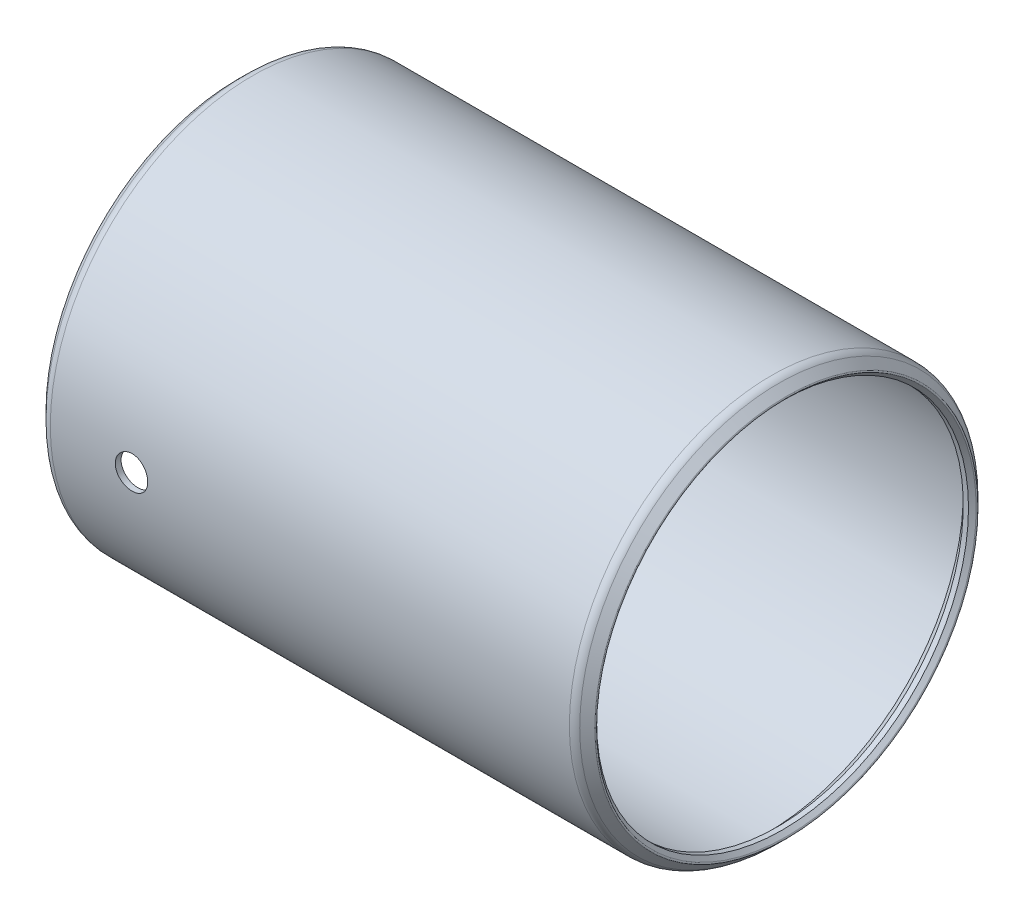
ISO-10303-21;
HEADER;
FILE_DESCRIPTION(('STEP AP214'),'2;1');
FILE_NAME('part.step','',(''),(''),'','','');
FILE_SCHEMA(('AUTOMOTIVE_DESIGN { 1 0 10303 214 1 1 1 1 }'));
ENDSEC;
DATA;
#1=APPLICATION_CONTEXT('core data for automotive mechanical design processes');
#2=APPLICATION_PROTOCOL_DEFINITION('international standard','automotive_design',2000,#1);
#3=PRODUCT_CONTEXT('',#1,'mechanical');
#4=PRODUCT('Part','Part','',(#3));
#5=PRODUCT_RELATED_PRODUCT_CATEGORY('part','',(#4));
#6=PRODUCT_DEFINITION_FORMATION('','',#4);
#7=PRODUCT_DEFINITION_CONTEXT('part definition',#1,'design');
#8=PRODUCT_DEFINITION('design','',#6,#7);
#9=PRODUCT_DEFINITION_SHAPE('','',#8);
#10=(LENGTH_UNIT() NAMED_UNIT(*) SI_UNIT(.MILLI.,.METRE.));
#11=(NAMED_UNIT(*) PLANE_ANGLE_UNIT() SI_UNIT($,.RADIAN.));
#12=(NAMED_UNIT(*) SI_UNIT($,.STERADIAN.) SOLID_ANGLE_UNIT());
#13=UNCERTAINTY_MEASURE_WITH_UNIT(LENGTH_MEASURE(1.E-05),#10,'distance_accuracy_value','');
#14=(GEOMETRIC_REPRESENTATION_CONTEXT(3) GLOBAL_UNCERTAINTY_ASSIGNED_CONTEXT((#13)) GLOBAL_UNIT_ASSIGNED_CONTEXT((#10,
#11,#12)) REPRESENTATION_CONTEXT('',''));
#15=CARTESIAN_POINT('',(0.,0.,0.));
#16=DIRECTION('',(0.,0.,1.));
#17=DIRECTION('',(1.,0.,0.));
#18=AXIS2_PLACEMENT_3D('',#15,#16,#17);
#19=CARTESIAN_POINT('',(-0.882617928474842,0.,0.));
#20=DIRECTION('',(-1.,0.,0.));
#21=DIRECTION('',(0.,0.,1.));
#22=AXIS2_PLACEMENT_3D('',#19,#20,#21);
#23=CONICAL_SURFACE('',#22,18.5546679284748,0.785398163397447);
#24=CARTESIAN_POINT('',(-0.882617928474839,0.,0.));
#25=DIRECTION('',(1.,0.,0.));
#26=DIRECTION('',(0.,0.,-1.));
#27=AXIS2_PLACEMENT_3D('',#24,#25,#26);
#28=CIRCLE('',#27,18.5546679284748);
#29=CARTESIAN_POINT('',(-0.882617928474839,0.,-18.5546679284748));
#30=VERTEX_POINT('',#29);
#31=EDGE_CURVE('E136',#30,#30,#28,.T.);
#32=ORIENTED_EDGE('',*,*,#31,.F.);
#33=EDGE_LOOP('',(#32));
#34=FACE_BOUND('',#33,.T.);
#35=CARTESIAN_POINT('',(-0.508000000000002,0.,0.));
#36=DIRECTION('',(-1.,0.,0.));
#37=DIRECTION('',(0.,0.,1.));
#38=AXIS2_PLACEMENT_3D('',#35,#36,#37);
#39=CIRCLE('',#38,18.18005);
#40=CARTESIAN_POINT('',(-0.508000000000002,0.,18.18005));
#41=VERTEX_POINT('',#40);
#42=EDGE_CURVE('E139',#41,#41,#39,.F.);
#43=ORIENTED_EDGE('',*,*,#42,.T.);
#44=EDGE_LOOP('',(#43));
#45=FACE_BOUND('',#44,.T.);
#46=ADVANCED_FACE('F15',(#34,#45),#23,.F.);
#47=CARTESIAN_POINT('',(52.7748179284748,0.,0.));
#48=DIRECTION('',(1.,0.,0.));
#49=DIRECTION('',(0.,0.,-1.));
#50=AXIS2_PLACEMENT_3D('',#47,#48,#49);
#51=CONICAL_SURFACE('',#50,18.5546679284749,0.785398163397458);
#52=CARTESIAN_POINT('',(52.4002,0.,0.));
#53=DIRECTION('',(-1.,0.,0.));
#54=DIRECTION('',(0.,0.,1.));
#55=AXIS2_PLACEMENT_3D('',#52,#53,#54);
#56=CIRCLE('',#55,18.18005);
#57=CARTESIAN_POINT('',(52.4002,0.,18.18005));
#58=VERTEX_POINT('',#57);
#59=EDGE_CURVE('E144',#58,#58,#56,.T.);
#60=ORIENTED_EDGE('',*,*,#59,.T.);
#61=EDGE_LOOP('',(#60));
#62=FACE_BOUND('',#61,.T.);
#63=CARTESIAN_POINT('',(52.7748179284749,0.,0.));
#64=DIRECTION('',(1.,0.,0.));
#65=DIRECTION('',(0.,0.,-1.));
#66=AXIS2_PLACEMENT_3D('',#63,#64,#65);
#67=CIRCLE('',#66,18.5546679284748);
#68=CARTESIAN_POINT('',(52.7748179284749,0.,-18.5546679284748));
#69=VERTEX_POINT('',#68);
#70=EDGE_CURVE('E112',#69,#69,#67,.F.);
#71=ORIENTED_EDGE('',*,*,#70,.F.);
#72=EDGE_LOOP('',(#71));
#73=FACE_BOUND('',#72,.T.);
#74=ADVANCED_FACE('F149',(#62,#73),#51,.F.);
#75=CARTESIAN_POINT('',(51.8922,0.,0.));
#76=DIRECTION('',(-1.,0.,0.));
#77=DIRECTION('',(0.,0.,1.));
#78=AXIS2_PLACEMENT_3D('',#75,#76,#77);
#79=CYLINDRICAL_SURFACE('',#78,18.18005);
#80=CARTESIAN_POINT('',(51.8922,0.,0.));
#81=DIRECTION('',(-1.,0.,0.));
#82=DIRECTION('',(0.,0.,1.));
#83=AXIS2_PLACEMENT_3D('',#80,#81,#82);
#84=CIRCLE('',#83,18.18005);
#85=CARTESIAN_POINT('',(51.8922,0.,18.18005));
#86=VERTEX_POINT('',#85);
#87=EDGE_CURVE('E107',#86,#86,#84,.T.);
#88=ORIENTED_EDGE('',*,*,#87,.T.);
#89=EDGE_LOOP('',(#88));
#90=FACE_BOUND('',#89,.T.);
#91=ORIENTED_EDGE('',*,*,#59,.F.);
#92=EDGE_LOOP('',(#91));
#93=FACE_BOUND('',#92,.T.);
#94=ADVANCED_FACE('F152',(#90,#93),#79,.F.);
#95=CARTESIAN_POINT('',(51.8922,0.,0.));
#96=DIRECTION('',(-1.,0.,0.));
#97=DIRECTION('',(0.,0.,1.));
#98=AXIS2_PLACEMENT_3D('',#95,#96,#97);
#99=CYLINDRICAL_SURFACE('',#98,18.18005);
#100=ORIENTED_EDGE('',*,*,#42,.F.);
#101=EDGE_LOOP('',(#100));
#102=FACE_BOUND('',#101,.T.);
#103=CARTESIAN_POINT('',(0.,0.,0.));
#104=DIRECTION('',(1.,0.,0.));
#105=DIRECTION('',(0.,0.,-1.));
#106=AXIS2_PLACEMENT_3D('',#103,#104,#105);
#107=CIRCLE('',#106,18.18005);
#108=CARTESIAN_POINT('',(0.,0.,-18.18005));
#109=VERTEX_POINT('',#108);
#110=EDGE_CURVE('E102',#109,#109,#107,.T.);
#111=ORIENTED_EDGE('',*,*,#110,.T.);
#112=EDGE_LOOP('',(#111));
#113=FACE_BOUND('',#112,.T.);
#114=ADVANCED_FACE('F130',(#102,#113),#99,.F.);
#115=CARTESIAN_POINT('',(-0.792815367264156,0.,0.));
#116=DIRECTION('',(1.,0.,0.));
#117=DIRECTION('',(0.,0.,-1.));
#118=AXIS2_PLACEMENT_3D('',#115,#116,#117);
#119=TOROIDAL_SURFACE('',#118,18.6444704896855,0.126999999999997);
#120=CARTESIAN_POINT('',(-0.882617928474837,0.,0.));
#121=DIRECTION('',(1.,0.,0.));
#122=DIRECTION('',(0.,0.,-1.));
#123=AXIS2_PLACEMENT_3D('',#120,#121,#122);
#124=CIRCLE('',#123,18.7342730508962);
#125=CARTESIAN_POINT('',(-0.882617928474839,0.,-18.7342730508962));
#126=VERTEX_POINT('',#125);
#127=EDGE_CURVE('E97',#126,#126,#124,.T.);
#128=ORIENTED_EDGE('',*,*,#127,.F.);
#129=EDGE_LOOP('',(#128));
#130=FACE_BOUND('',#129,.T.);
#131=ORIENTED_EDGE('',*,*,#31,.T.);
#132=EDGE_LOOP('',(#131));
#133=FACE_BOUND('',#132,.T.);
#134=ADVANCED_FACE('F124',(#130,#133),#119,.T.);
#135=CARTESIAN_POINT('',(52.6850153672642,0.,0.));
#136=DIRECTION('',(1.,0.,0.));
#137=DIRECTION('',(0.,0.,-1.));
#138=AXIS2_PLACEMENT_3D('',#135,#136,#137);
#139=TOROIDAL_SURFACE('',#138,18.6444704896855,0.126999999999982);
#140=ORIENTED_EDGE('',*,*,#70,.T.);
#141=EDGE_LOOP('',(#140));
#142=FACE_BOUND('',#141,.T.);
#143=CARTESIAN_POINT('',(52.7748179284749,0.,0.));
#144=DIRECTION('',(-1.,0.,0.));
#145=DIRECTION('',(0.,0.,1.));
#146=AXIS2_PLACEMENT_3D('',#143,#144,#145);
#147=CIRCLE('',#146,18.7342730508962);
#148=CARTESIAN_POINT('',(52.7748179284749,0.,18.7342730508962));
#149=VERTEX_POINT('',#148);
#150=EDGE_CURVE('E92',#149,#149,#147,.T.);
#151=ORIENTED_EDGE('',*,*,#150,.F.);
#152=EDGE_LOOP('',(#151));
#153=FACE_BOUND('',#152,.T.);
#154=ADVANCED_FACE('F119',(#142,#153),#139,.T.);
#155=CARTESIAN_POINT('',(50.8762,0.,0.));
#156=DIRECTION('',(-1.,0.,0.));
#157=DIRECTION('',(0.,-1.,0.));
#158=AXIS2_PLACEMENT_3D('',#155,#156,#157);
#159=CONICAL_SURFACE('',#158,19.19605,0.785398163397448);
#160=CARTESIAN_POINT('',(50.8762,0.,0.));
#161=DIRECTION('',(-1.,0.,0.));
#162=DIRECTION('',(0.,0.,1.));
#163=AXIS2_PLACEMENT_3D('',#160,#161,#162);
#164=CIRCLE('',#163,19.19605);
#165=CARTESIAN_POINT('',(50.8762,0.,19.19605));
#166=VERTEX_POINT('',#165);
#167=EDGE_CURVE('E87',#166,#166,#164,.T.);
#168=ORIENTED_EDGE('',*,*,#167,.T.);
#169=EDGE_LOOP('',(#168));
#170=FACE_BOUND('',#169,.T.);
#171=ORIENTED_EDGE('',*,*,#87,.F.);
#172=EDGE_LOOP('',(#171));
#173=FACE_BOUND('',#172,.T.);
#174=ADVANCED_FACE('F123',(#170,#173),#159,.F.);
#175=CARTESIAN_POINT('',(1.016,0.,0.));
#176=DIRECTION('',(1.,0.,0.));
#177=DIRECTION('',(0.,0.,-1.));
#178=AXIS2_PLACEMENT_3D('',#175,#176,#177);
#179=CONICAL_SURFACE('',#178,19.19605,0.785398163397447);
#180=ORIENTED_EDGE('',*,*,#110,.F.);
#181=EDGE_LOOP('',(#180));
#182=FACE_BOUND('',#181,.T.);
#183=CARTESIAN_POINT('',(1.016,0.,0.));
#184=DIRECTION('',(-1.,0.,0.));
#185=DIRECTION('',(0.,0.,1.));
#186=AXIS2_PLACEMENT_3D('',#183,#184,#185);
#187=CIRCLE('',#186,19.19605);
#188=CARTESIAN_POINT('',(1.016,0.,19.19605));
#189=VERTEX_POINT('',#188);
#190=EDGE_CURVE('E82',#189,#189,#187,.F.);
#191=ORIENTED_EDGE('',*,*,#190,.T.);
#192=EDGE_LOOP('',(#191));
#193=FACE_BOUND('',#192,.T.);
#194=ADVANCED_FACE('F163',(#182,#193),#179,.F.);
#195=CARTESIAN_POINT('',(-0.146920489685527,0.,0.));
#196=DIRECTION('',(1.,0.,0.));
#197=DIRECTION('',(0.,0.,-1.));
#198=AXIS2_PLACEMENT_3D('',#195,#196,#197);
#199=CONICAL_SURFACE('',#198,19.4699704896855,0.785398163397447);
#200=CARTESIAN_POINT('',(-0.146920489685532,0.,0.));
#201=DIRECTION('',(1.,0.,0.));
#202=DIRECTION('',(0.,0.,-1.));
#203=AXIS2_PLACEMENT_3D('',#200,#201,#202);
#204=CIRCLE('',#203,19.4699704896855);
#205=CARTESIAN_POINT('',(-0.146920489685532,0.,-19.4699704896855));
#206=VERTEX_POINT('',#205);
#207=EDGE_CURVE('E79',#206,#206,#204,.T.);
#208=ORIENTED_EDGE('',*,*,#207,.F.);
#209=EDGE_LOOP('',(#208));
#210=FACE_BOUND('',#209,.T.);
#211=ORIENTED_EDGE('',*,*,#127,.T.);
#212=EDGE_LOOP('',(#211));
#213=FACE_BOUND('',#212,.T.);
#214=ADVANCED_FACE('F168',(#210,#213),#199,.T.);
#215=CARTESIAN_POINT('',(52.0391204896855,0.,0.));
#216=DIRECTION('',(-1.,0.,0.));
#217=DIRECTION('',(0.,-1.,0.));
#218=AXIS2_PLACEMENT_3D('',#215,#216,#217);
#219=CONICAL_SURFACE('',#218,19.4699704896856,0.785398163397455);
#220=ORIENTED_EDGE('',*,*,#150,.T.);
#221=EDGE_LOOP('',(#220));
#222=FACE_BOUND('',#221,.T.);
#223=CARTESIAN_POINT('',(52.0391204896855,0.,0.));
#224=DIRECTION('',(1.,0.,0.));
#225=DIRECTION('',(0.,0.,-1.));
#226=AXIS2_PLACEMENT_3D('',#223,#224,#225);
#227=CIRCLE('',#226,19.4699704896856);
#228=CARTESIAN_POINT('',(52.0391204896855,0.,-19.4699704896856));
#229=VERTEX_POINT('',#228);
#230=EDGE_CURVE('E58',#229,#229,#227,.F.);
#231=ORIENTED_EDGE('',*,*,#230,.F.);
#232=EDGE_LOOP('',(#231));
#233=FACE_BOUND('',#232,.T.);
#234=ADVANCED_FACE('F173',(#222,#233),#219,.T.);
#235=CARTESIAN_POINT('',(51.8922,0.,0.));
#236=DIRECTION('',(-1.,0.,0.));
#237=DIRECTION('',(0.,0.,1.));
#238=AXIS2_PLACEMENT_3D('',#235,#236,#237);
#239=CYLINDRICAL_SURFACE('',#238,19.19605);
#240=CARTESIAN_POINT('',(6.92235409279213,-0.0520675466295963,19.1959793901134));
#241=CARTESIAN_POINT('',(6.92527801071174,-0.141049004046406,19.1957371868563));
#242=CARTESIAN_POINT('',(6.93570661972119,-0.229843303555058,19.1948719150644));
#243=CARTESIAN_POINT('',(6.97130310530289,-0.404478805777331,19.1919875283014));
#244=CARTESIAN_POINT('',(6.99648776725898,-0.49031652738443,19.1899670993733));
#245=CARTESIAN_POINT('',(7.0608609711587,-0.656491701388831,19.185000956597));
#246=CARTESIAN_POINT('',(7.10004151000346,-0.736832265942049,19.1820557716575));
#247=CARTESIAN_POINT('',(7.1912822794191,-0.889778272078497,19.1755703353355));
#248=CARTESIAN_POINT('',(7.24333973072414,-0.962385377967878,19.1720302124133));
#249=CARTESIAN_POINT('',(7.35900173983082,-1.09800752330528,19.1647422595292));
#250=CARTESIAN_POINT('',(7.4226322055214,-1.16100044602403,19.1609939769207));
#251=CARTESIAN_POINT('',(7.55957177411014,-1.27542307288185,19.1537183782156));
#252=CARTESIAN_POINT('',(7.632881278836,-1.32685229671136,19.1501910713017));
#253=CARTESIAN_POINT('',(7.78719657994702,-1.41673474202272,19.1437519561699));
#254=CARTESIAN_POINT('',(7.8682105249304,-1.45517402464308,19.1408408103671));
#255=CARTESIAN_POINT('',(8.03557160694401,-1.51789569239402,19.1359693868989));
#256=CARTESIAN_POINT('',(8.1219186419937,-1.54217834813815,19.1340090910575));
#257=CARTESIAN_POINT('',(8.29726022426123,-1.5758399811269,19.1312663436261));
#258=CARTESIAN_POINT('',(8.386247457632,-1.58525681069041,19.1304809008189));
#259=CARTESIAN_POINT('',(8.56454203741958,-1.58903173133472,19.1301677434016));
#260=CARTESIAN_POINT('',(8.65384937848287,-1.58339007309246,19.1306400078545));
#261=CARTESIAN_POINT('',(8.83004258252696,-1.5572419840316,19.1327860372163));
#262=CARTESIAN_POINT('',(8.91693335829279,-1.53676841358195,19.1344571459845));
#263=CARTESIAN_POINT('',(9.08604238685167,-1.48158341837589,19.1388089106193));
#264=CARTESIAN_POINT('',(9.16826058351017,-1.44687182261052,19.1414895786114));
#265=CARTESIAN_POINT('',(9.32583776673758,-1.36413487973526,19.14756347456));
#266=CARTESIAN_POINT('',(9.40118565386427,-1.31608847850913,19.1509578272705));
#267=CARTESIAN_POINT('',(9.54276226193703,-1.2080647707277,19.1580749560149));
#268=CARTESIAN_POINT('',(9.60899080722364,-1.14808723440571,19.1617977383729));
#269=CARTESIAN_POINT('',(9.73064864189472,-1.01769561110883,19.1691652948775));
#270=CARTESIAN_POINT('',(9.78604599135648,-0.947251703825906,19.1728098109119));
#271=CARTESIAN_POINT('',(9.88423089052008,-0.798042638645832,19.1795993711927));
#272=CARTESIAN_POINT('',(9.92701846707783,-0.719277498471469,19.1827444165028));
#273=CARTESIAN_POINT('',(9.99874991426734,-0.555676634538799,19.1881799191658));
#274=CARTESIAN_POINT('',(10.0276979194716,-0.470842732541325,19.1904706317055));
#275=CARTESIAN_POINT('',(10.0709319413772,-0.297496164340966,19.1939402371683));
#276=CARTESIAN_POINT('',(10.0852182644144,-0.208983575039401,19.1951191533208));
#277=CARTESIAN_POINT('',(10.0986931850631,-0.0310784295023128,19.1962302983791));
#278=CARTESIAN_POINT('',(10.09792725872,0.0583106609062892,19.1961662824539));
#279=CARTESIAN_POINT('',(10.0814316810219,0.235687050165702,19.1948080182327));
#280=CARTESIAN_POINT('',(10.065702129642,0.323674358378119,19.1935137781562));
#281=CARTESIAN_POINT('',(10.0197588819417,0.495659487112968,19.1898424385296));
#282=CARTESIAN_POINT('',(9.98956018548456,0.579661340382605,19.1874664605215));
#283=CARTESIAN_POINT('',(9.91554937373918,0.741407693790297,19.1818978685779));
#284=CARTESIAN_POINT('',(9.87173702461638,0.819152086418332,19.1787052406154));
#285=CARTESIAN_POINT('',(9.77161121567778,0.96639311565752,19.1718510893885));
#286=CARTESIAN_POINT('',(9.71526610666613,1.03586817534971,19.1681883891273));
#287=CARTESIAN_POINT('',(9.59172786180993,1.16438899423,19.1608112169558));
#288=CARTESIAN_POINT('',(9.52453455940321,1.22343459325596,19.1570967442512));
#289=CARTESIAN_POINT('',(9.38102949989085,1.32954933910148,19.1500255113371));
#290=CARTESIAN_POINT('',(9.30469812804624,1.37659201923937,19.1466695509593));
#291=CARTESIAN_POINT('',(9.14519168312233,1.45718930060136,19.1407046845613));
#292=CARTESIAN_POINT('',(9.06201669464142,1.49074406852815,19.1380957693081));
#293=CARTESIAN_POINT('',(8.89132127698833,1.54335677018328,19.1339250095147));
#294=CARTESIAN_POINT('',(8.80380799313386,1.56243774955088,19.1323615009165));
#295=CARTESIAN_POINT('',(8.62680757092979,1.58563680425244,19.1304529411481));
#296=CARTESIAN_POINT('',(8.53732046824699,1.58975514973783,19.1301078679789));
#297=CARTESIAN_POINT('',(8.35918919762829,1.58291961525621,19.1306746286185));
#298=CARTESIAN_POINT('',(8.27054333712618,1.57200943994938,19.1315828178106));
#299=CARTESIAN_POINT('',(8.09634717011216,1.53551070132675,19.1345466048625));
#300=CARTESIAN_POINT('',(8.01079687674403,1.50992207569405,19.1366022075936));
#301=CARTESIAN_POINT('',(7.84518003481092,1.44479065874193,19.1416294007561));
#302=CARTESIAN_POINT('',(7.7651154035579,1.40524301797069,19.1446013094727));
#303=CARTESIAN_POINT('',(7.61275261345169,1.31332132343631,19.151126263508));
#304=CARTESIAN_POINT('',(7.54045433373409,1.26094746932367,19.1546792997806));
#305=CARTESIAN_POINT('',(7.40544565148514,1.14467648278919,19.1619791634504));
#306=CARTESIAN_POINT('',(7.3427641133489,1.08074586737429,19.1657265307649));
#307=CARTESIAN_POINT('',(7.22899785193757,0.943246345406641,19.1729849489935));
#308=CARTESIAN_POINT('',(7.17791591081017,0.869675133228796,19.1764959430719));
#309=CARTESIAN_POINT('',(7.08875217623684,0.714874560329658,19.1828907136619));
#310=CARTESIAN_POINT('',(7.05068958239491,0.633634112992087,19.1857735615947));
#311=CARTESIAN_POINT('',(6.98879634850847,0.465947157606696,19.1905767534688));
#312=CARTESIAN_POINT('',(6.96494930529334,0.379506777052809,19.1924982063405));
#313=CARTESIAN_POINT('',(6.93794952684563,0.235120090259955,19.194694019426));
#314=CARTESIAN_POINT('',(6.93045539253854,0.177954164219627,19.1953109647284));
#315=CARTESIAN_POINT('',(6.92171187320832,0.0631435311891627,19.1960319957794));
#316=CARTESIAN_POINT('',(6.92046247006327,0.00549882558890976,19.1961360830161));
#317=CARTESIAN_POINT('',(6.92235409279213,-0.0520675466295963,19.1959793901134));
#318=B_SPLINE_CURVE_WITH_KNOTS('',3,(#240,#241,#242,#243,#244,#245,#246,#247,#248,#249,#250,
#251,#252,#253,#254,#255,#256,#257,#258,#259,#260,#261,#262,#263,#264,#265,#266,#267,#268,#269,
#270,#271,#272,#273,#274,#275,#276,#277,#278,#279,#280,#281,#282,#283,#284,#285,#286,#287,#288,
#289,#290,#291,#292,#293,#294,#295,#296,#297,#298,#299,#300,#301,#302,#303,#304,#305,#306,#307,
#308,#309,#310,#311,#312,#313,#314,#315,#316,#317),.UNSPECIFIED.,.T.,.F.,(4,2,2,2,2,2,2,2,2,2,2,
2,2,2,2,2,2,2,2,2,2,2,2,2,2,2,2,2,2,2,2,2,2,2,2,2,2,2,4),(0.,0.266879072158912,0.53406231703265,
0.801093025555706,1.06806615018559,1.33564445891231,1.60323387971372,1.87110953240126,
2.13898006429554,2.40616742054894,2.67335032899237,2.93994309217577,3.20653905742424,
3.47355836521023,3.7405828156821,4.0083831913577,4.27618299667615,4.543902746721,
4.81161690301602,5.07852236261116,5.34542603896756,5.61205361851786,5.87868577804427,
6.14599907124326,6.41331646913681,6.68121831030503,6.94911684026171,7.21658791283139,
7.48405415616776,7.75074421699886,8.0174354100627,8.28421934470441,8.55099912689981,
8.81856460358049,9.08619418785421,9.35421676031204,9.62192946273942,9.79458683467821,
9.96724370557283),.UNSPECIFIED.);
#319=CARTESIAN_POINT('',(6.92235409279213,-0.0520675466295963,19.1959793901134));
#320=VERTEX_POINT('',#319);
#321=EDGE_CURVE('E18',#320,#320,#318,.T.);
#322=ORIENTED_EDGE('',*,*,#321,.T.);
#323=EDGE_LOOP('',(#322));
#324=FACE_BOUND('',#323,.T.);
#325=ORIENTED_EDGE('',*,*,#190,.F.);
#326=EDGE_LOOP('',(#325));
#327=FACE_BOUND('',#326,.T.);
#328=ORIENTED_EDGE('',*,*,#167,.F.);
#329=EDGE_LOOP('',(#328));
#330=FACE_BOUND('',#329,.T.);
#331=ADVANCED_FACE('F73',(#324,#327,#330),#239,.F.);
#332=CARTESIAN_POINT('',(0.571500000000003,0.,0.));
#333=DIRECTION('',(1.,0.,0.));
#334=DIRECTION('',(0.,0.,-1.));
#335=AXIS2_PLACEMENT_3D('',#332,#333,#334);
#336=TOROIDAL_SURFACE('',#335,18.75155,1.01600000000001);
#337=CARTESIAN_POINT('',(0.571499999999996,0.,0.));
#338=DIRECTION('',(-1.,0.,0.));
#339=DIRECTION('',(0.,0.,1.));
#340=AXIS2_PLACEMENT_3D('',#337,#338,#339);
#341=CIRCLE('',#340,19.76755);
#342=CARTESIAN_POINT('',(0.571499999999996,0.,19.76755));
#343=VERTEX_POINT('',#342);
#344=EDGE_CURVE('E30',#343,#343,#341,.F.);
#345=ORIENTED_EDGE('',*,*,#344,.F.);
#346=EDGE_LOOP('',(#345));
#347=FACE_BOUND('',#346,.T.);
#348=ORIENTED_EDGE('',*,*,#207,.T.);
#349=EDGE_LOOP('',(#348));
#350=FACE_BOUND('',#349,.T.);
#351=ADVANCED_FACE('F69',(#347,#350),#336,.T.);
#352=CARTESIAN_POINT('',(51.3207,0.,0.));
#353=DIRECTION('',(1.,0.,0.));
#354=DIRECTION('',(0.,0.,-1.));
#355=AXIS2_PLACEMENT_3D('',#352,#353,#354);
#356=TOROIDAL_SURFACE('',#355,18.75155,1.016);
#357=ORIENTED_EDGE('',*,*,#230,.T.);
#358=EDGE_LOOP('',(#357));
#359=FACE_BOUND('',#358,.T.);
#360=CARTESIAN_POINT('',(51.3207,0.,0.));
#361=DIRECTION('',(-1.,0.,0.));
#362=DIRECTION('',(0.,0.,1.));
#363=AXIS2_PLACEMENT_3D('',#360,#361,#362);
#364=CIRCLE('',#363,19.76755);
#365=CARTESIAN_POINT('',(51.3207,0.,19.76755));
#366=VERTEX_POINT('',#365);
#367=EDGE_CURVE('E26',#366,#366,#364,.T.);
#368=ORIENTED_EDGE('',*,*,#367,.F.);
#369=EDGE_LOOP('',(#368));
#370=FACE_BOUND('',#369,.T.);
#371=ADVANCED_FACE('F48',(#359,#370),#356,.T.);
#372=CARTESIAN_POINT('',(8.509,0.,19.76755));
#373=DIRECTION('',(0.,0.,1.));
#374=DIRECTION('',(1.,0.,0.));
#375=AXIS2_PLACEMENT_3D('',#372,#373,#374);
#376=CYLINDRICAL_SURFACE('',#375,1.5875);
#377=CARTESIAN_POINT('',(6.92235434912674,0.0520779693461488,19.7674814898849));
#378=CARTESIAN_POINT('',(6.92527909901012,0.141067427472473,19.7672462392573));
#379=CARTESIAN_POINT('',(6.93570998765343,0.22986994812646,19.7664057279669));
#380=CARTESIAN_POINT('',(6.97131403983959,0.404522302633487,19.7636041194008));
#381=CARTESIAN_POINT('',(6.99650404750117,0.490368643978813,19.7616417418366));
#382=CARTESIAN_POINT('',(7.06089176822974,0.656561114243799,19.7568183007774));
#383=CARTESIAN_POINT('',(7.10008154982558,0.736910326873057,19.7539577462489));
#384=CARTESIAN_POINT('',(7.19134451349581,0.889871639943971,19.7476588338192));
#385=CARTESIAN_POINT('',(7.24341489101277,0.962485419743182,19.7442206017509));
#386=CARTESIAN_POINT('',(7.35909854598795,1.09810908144573,19.7371431331852));
#387=CARTESIAN_POINT('',(7.42273633444312,1.16109803672677,19.7335034815));
#388=CARTESIAN_POINT('',(7.55968958873802,1.27551091380439,19.7264391038936));
#389=CARTESIAN_POINT('',(7.63300545508217,1.32693435675126,19.7230143868756));
#390=CARTESIAN_POINT('',(7.78732641631548,1.41680060828596,19.7167631286054));
#391=CARTESIAN_POINT('',(7.86833917524966,1.45523030131775,19.713937192815));
#392=CARTESIAN_POINT('',(8.03569457965512,1.51793370438399,19.7092086458298));
#393=CARTESIAN_POINT('',(8.12203712846071,1.54220767107558,19.7073060178946));
#394=CARTESIAN_POINT('',(8.29737991565091,1.57585639033122,19.7046440544325));
#395=CARTESIAN_POINT('',(8.38637326171659,1.5852668407227,19.7038819798612));
#396=CARTESIAN_POINT('',(8.56467876722936,1.58902724917799,19.7035791037359));
#397=CARTESIAN_POINT('',(8.65399092161764,1.58337744516441,19.7040382828885));
#398=CARTESIAN_POINT('',(8.83020419969258,1.55720962451545,19.7061234128166));
#399=CARTESIAN_POINT('',(8.91710995530327,1.53672258288916,19.7077469327834));
#400=CARTESIAN_POINT('',(9.08624659437983,1.48150495492209,19.7119744583052));
#401=CARTESIAN_POINT('',(9.16847742455801,1.44677420625978,19.7145784750339));
#402=CARTESIAN_POINT('',(9.32606884608113,1.36399724099097,19.7204782113898));
#403=CARTESIAN_POINT('',(9.40141896078018,1.31593115481789,19.7237749613928));
#404=CARTESIAN_POINT('',(9.54299574788824,1.20786585964997,19.7306871518625));
#405=CARTESIAN_POINT('',(9.60922225476364,1.14786643419159,19.7343025981095));
#406=CARTESIAN_POINT('',(9.73086032991639,1.01744128718754,19.7414567291186));
#407=CARTESIAN_POINT('',(9.78624177547081,0.946987454736997,19.7449951764748));
#408=CARTESIAN_POINT('',(9.88439324376948,0.797762514370543,19.7515866953626));
#409=CARTESIAN_POINT('',(9.92716329194593,0.718991423227685,19.754639767873));
#410=CARTESIAN_POINT('',(9.99885958829911,0.555382120407996,19.7599158298543));
#411=CARTESIAN_POINT('',(10.0277897599335,0.470545636054029,19.7621390545388));
#412=CARTESIAN_POINT('',(10.0709884398033,0.297198256165437,19.7655057187957));
#413=CARTESIAN_POINT('',(10.0852572368997,0.208687433059013,19.7666491796416));
#414=CARTESIAN_POINT('',(10.0986997032535,0.030773873026046,19.7677256144946));
#415=CARTESIAN_POINT('',(10.0979162679057,-0.0586256039303849,19.7676620283138));
#416=CARTESIAN_POINT('',(10.0813823596403,-0.23601992458948,19.7663399955468));
#417=CARTESIAN_POINT('',(10.0656319808769,-0.32401477712482,19.7650815564772));
#418=CARTESIAN_POINT('',(10.0196424612263,-0.496017236803769,19.7615130287287));
#419=CARTESIAN_POINT('',(9.9894174428936,-0.580028642878425,19.7592039652277));
#420=CARTESIAN_POINT('',(9.9153493200129,-0.741789293370257,19.7537930022971));
#421=CARTESIAN_POINT('',(9.87150599454518,-0.819538436173592,19.7506910900056));
#422=CARTESIAN_POINT('',(9.77132171943104,-0.966771872203983,19.7440329572063));
#423=CARTESIAN_POINT('',(9.71495089064555,-1.03623578536448,19.7404756593128));
#424=CARTESIAN_POINT('',(9.59136246923536,-1.16472922276184,19.7333116564293));
#425=CARTESIAN_POINT('',(9.52414471960416,-1.2237585959354,19.7297049507247));
#426=CARTESIAN_POINT('',(9.38060298033674,-1.32982871399388,19.7228402638772));
#427=CARTESIAN_POINT('',(9.30426052303428,-1.37684452004053,19.7195830161675));
#428=CARTESIAN_POINT('',(9.14473824652784,-1.45738686104281,19.7137945274564));
#429=CARTESIAN_POINT('',(9.06155850752557,-1.4909135541993,19.7112632779405));
#430=CARTESIAN_POINT('',(8.89085255990805,-1.54347287067968,19.7072175530026));
#431=CARTESIAN_POINT('',(8.8033330947641,-1.56252727431521,19.7057015500767));
#432=CARTESIAN_POINT('',(8.62632559841066,-1.58567254785997,19.7038527471204));
#433=CARTESIAN_POINT('',(8.53683760050426,-1.58976367071814,19.7035199270887));
#434=CARTESIAN_POINT('',(8.35869393812246,-1.58287348696881,19.7040745882021));
#435=CARTESIAN_POINT('',(8.27003666661993,-1.57193337221893,19.7049587343644));
#436=CARTESIAN_POINT('',(8.09582252774334,-1.53537050246479,19.7078411490683));
#437=CARTESIAN_POINT('',(8.01026567318423,-1.50974768677987,19.7098394222145));
#438=CARTESIAN_POINT('',(7.8446426345777,-1.44454456627643,19.714725119315));
#439=CARTESIAN_POINT('',(7.7645782860387,-1.40495962241631,19.7176128387555));
#440=CARTESIAN_POINT('',(7.61222301330696,-1.31296087402369,19.7239520414243));
#441=CARTESIAN_POINT('',(7.53993195785071,-1.26054728617072,19.7274035151304));
#442=CARTESIAN_POINT('',(7.40495786788121,-1.14420618720083,19.7344932046027));
#443=CARTESIAN_POINT('',(7.34230201447469,-1.0802471709923,19.738131911366));
#444=CARTESIAN_POINT('',(7.22859212972952,-0.942695717574981,19.7451789183395));
#445=CARTESIAN_POINT('',(7.17754088694543,-0.869100971609566,19.7485871630323));
#446=CARTESIAN_POINT('',(7.08844560143506,-0.714264638961273,19.7547935195726));
#447=CARTESIAN_POINT('',(7.05041997176575,-0.63301243271992,19.7575907657041));
#448=CARTESIAN_POINT('',(6.98860162571982,-0.465310246591892,19.7622500660496));
#449=CARTESIAN_POINT('',(6.9647924676865,-0.378866398846832,19.7641132001827));
#450=CARTESIAN_POINT('',(6.93787278378314,-0.234580550737807,19.7662393406244));
#451=CARTESIAN_POINT('',(6.9304102587637,-0.177518567054522,19.7668359220216));
#452=CARTESIAN_POINT('',(6.92170680988291,-0.0629190859140971,19.7675329453967));
#453=CARTESIAN_POINT('',(6.92046586882393,-0.00538158977180281,19.7676333887461));
#454=CARTESIAN_POINT('',(6.92235434912674,0.0520779693461488,19.7674814898849));
#455=B_SPLINE_CURVE_WITH_KNOTS('',3,(#377,#378,#379,#380,#381,#382,#383,#384,#385,#386,#387,
#388,#389,#390,#391,#392,#393,#394,#395,#396,#397,#398,#399,#400,#401,#402,#403,#404,#405,#406,
#407,#408,#409,#410,#411,#412,#413,#414,#415,#416,#417,#418,#419,#420,#421,#422,#423,#424,#425,
#426,#427,#428,#429,#430,#431,#432,#433,#434,#435,#436,#437,#438,#439,#440,#441,#442,#443,#444,
#445,#446,#447,#448,#449,#450,#451,#452,#453,#454),.UNSPECIFIED.,.T.,.F.,(4,2,2,2,2,2,2,2,2,2,2,
2,2,2,2,2,2,2,2,2,2,2,2,2,2,2,2,2,2,2,2,2,2,2,2,2,2,2,4),(0.,0.266903495631118,
0.534112194806518,0.801169748279985,1.06816920506205,1.33574116465844,1.60332420056268,
1.8711765271637,2.13902399718958,2.40622719224356,2.67342616603376,2.94006892306729,
3.20671471885079,3.47375996883779,3.74081006330575,4.00859169797695,4.27637279263479,
4.54407792915164,4.81177779119479,5.07871488374728,5.34565029706201,5.61232579694581,
5.87900562313516,6.14632846267945,6.41365517200304,6.681532394414,6.94940647505859,
7.21687661096639,7.48434222536573,7.75107633258489,8.01781154217058,8.28463546052377,
8.5514548724542,8.8190136995738,9.08663675250354,9.3546365721316,9.62232584080173,
9.79466310300175,9.96699988882905),.UNSPECIFIED.);
#456=CARTESIAN_POINT('',(6.92235434912674,0.0520779693461488,19.7674814898849));
#457=VERTEX_POINT('',#456);
#458=EDGE_CURVE('E10',#457,#457,#455,.T.);
#459=ORIENTED_EDGE('',*,*,#458,.F.);
#460=EDGE_LOOP('',(#459));
#461=FACE_BOUND('',#460,.T.);
#462=ORIENTED_EDGE('',*,*,#321,.F.);
#463=EDGE_LOOP('',(#462));
#464=FACE_BOUND('',#463,.T.);
#465=ADVANCED_FACE('F38',(#461,#464),#376,.F.);
#466=CARTESIAN_POINT('',(51.8922,0.,0.));
#467=DIRECTION('',(-1.,0.,0.));
#468=DIRECTION('',(0.,0.,1.));
#469=AXIS2_PLACEMENT_3D('',#466,#467,#468);
#470=CYLINDRICAL_SURFACE('',#469,19.76755);
#471=ORIENTED_EDGE('',*,*,#458,.T.);
#472=EDGE_LOOP('',(#471));
#473=FACE_BOUND('',#472,.T.);
#474=ORIENTED_EDGE('',*,*,#367,.T.);
#475=EDGE_LOOP('',(#474));
#476=FACE_BOUND('',#475,.T.);
#477=ORIENTED_EDGE('',*,*,#344,.T.);
#478=EDGE_LOOP('',(#477));
#479=FACE_BOUND('',#478,.T.);
#480=ADVANCED_FACE('F41',(#473,#476,#479),#470,.T.);
#481=CLOSED_SHELL('',(#46,#74,#94,#114,#134,#154,#174,#194,#214,#234,#331,#351,#371,#465,#480));
#482=MANIFOLD_SOLID_BREP('B1',#481);
#483=ADVANCED_BREP_SHAPE_REPRESENTATION('',(#18,#482),#14);
#484=SHAPE_DEFINITION_REPRESENTATION(#9,#483);
ENDSEC;
END-ISO-10303-21;
